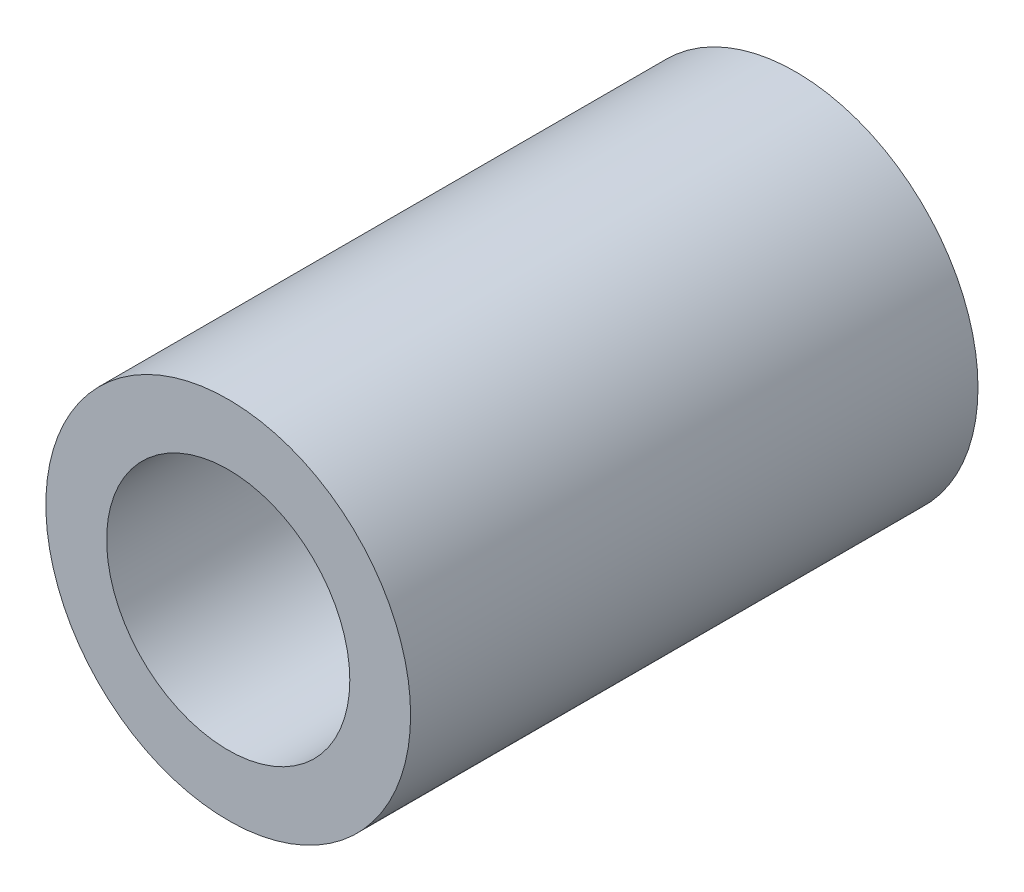
ISO-10303-21;
HEADER;
FILE_DESCRIPTION(('STEP AP214'),'2;1');
FILE_NAME('part.step','',(''),(''),'','','');
FILE_SCHEMA(('AUTOMOTIVE_DESIGN { 1 0 10303 214 1 1 1 1 }'));
ENDSEC;
DATA;
#1=APPLICATION_CONTEXT('core data for automotive mechanical design processes');
#2=APPLICATION_PROTOCOL_DEFINITION('international standard','automotive_design',2000,#1);
#3=PRODUCT_CONTEXT('',#1,'mechanical');
#4=PRODUCT('Part','Part','',(#3));
#5=PRODUCT_RELATED_PRODUCT_CATEGORY('part','',(#4));
#6=PRODUCT_DEFINITION_FORMATION('','',#4);
#7=PRODUCT_DEFINITION_CONTEXT('part definition',#1,'design');
#8=PRODUCT_DEFINITION('design','',#6,#7);
#9=PRODUCT_DEFINITION_SHAPE('','',#8);
#10=(LENGTH_UNIT() NAMED_UNIT(*) SI_UNIT(.MILLI.,.METRE.));
#11=(NAMED_UNIT(*) PLANE_ANGLE_UNIT() SI_UNIT($,.RADIAN.));
#12=(NAMED_UNIT(*) SI_UNIT($,.STERADIAN.) SOLID_ANGLE_UNIT());
#13=UNCERTAINTY_MEASURE_WITH_UNIT(LENGTH_MEASURE(1.E-05),#10,'distance_accuracy_value','');
#14=(GEOMETRIC_REPRESENTATION_CONTEXT(3) GLOBAL_UNCERTAINTY_ASSIGNED_CONTEXT((#13)) GLOBAL_UNIT_ASSIGNED_CONTEXT((#10,
#11,#12)) REPRESENTATION_CONTEXT('',''));
#15=CARTESIAN_POINT('',(0.,0.,0.));
#16=DIRECTION('',(0.,0.,1.));
#17=DIRECTION('',(1.,0.,0.));
#18=AXIS2_PLACEMENT_3D('',#15,#16,#17);
#19=CARTESIAN_POINT('',(0.,0.,7.));
#20=DIRECTION('',(0.,0.,1.));
#21=DIRECTION('',(1.,0.,0.));
#22=AXIS2_PLACEMENT_3D('',#19,#20,#21);
#23=PLANE('',#22);
#24=CARTESIAN_POINT('',(0.,0.,7.));
#25=DIRECTION('',(0.,0.,1.));
#26=DIRECTION('',(1.,0.,0.));
#27=AXIS2_PLACEMENT_3D('',#24,#25,#26);
#28=CIRCLE('',#27,2.25);
#29=CARTESIAN_POINT('',(2.25,0.,7.));
#30=VERTEX_POINT('',#29);
#31=EDGE_CURVE('E10',#30,#30,#28,.T.);
#32=ORIENTED_EDGE('',*,*,#31,.T.);
#33=EDGE_LOOP('',(#32));
#34=FACE_BOUND('',#33,.T.);
#35=CARTESIAN_POINT('',(0.,0.,7.));
#36=DIRECTION('',(0.,0.,1.));
#37=DIRECTION('',(1.,0.,0.));
#38=AXIS2_PLACEMENT_3D('',#35,#36,#37);
#39=CIRCLE('',#38,1.5);
#40=CARTESIAN_POINT('',(1.5,0.,7.));
#41=VERTEX_POINT('',#40);
#42=EDGE_CURVE('E46',#41,#41,#39,.T.);
#43=ORIENTED_EDGE('',*,*,#42,.F.);
#44=EDGE_LOOP('',(#43));
#45=FACE_BOUND('',#44,.T.);
#46=ADVANCED_FACE('F35',(#34,#45),#23,.T.);
#47=CARTESIAN_POINT('',(0.,0.,0.));
#48=DIRECTION('',(0.,0.,1.));
#49=DIRECTION('',(1.,0.,0.));
#50=AXIS2_PLACEMENT_3D('',#47,#48,#49);
#51=PLANE('',#50);
#52=CARTESIAN_POINT('',(0.,0.,0.));
#53=DIRECTION('',(0.,0.,1.));
#54=DIRECTION('',(1.,0.,0.));
#55=AXIS2_PLACEMENT_3D('',#52,#53,#54);
#56=CIRCLE('',#55,2.25);
#57=CARTESIAN_POINT('',(2.25,0.,0.));
#58=VERTEX_POINT('',#57);
#59=EDGE_CURVE('E39',#58,#58,#56,.T.);
#60=ORIENTED_EDGE('',*,*,#59,.F.);
#61=EDGE_LOOP('',(#60));
#62=FACE_BOUND('',#61,.T.);
#63=CARTESIAN_POINT('',(0.,0.,0.));
#64=DIRECTION('',(0.,0.,1.));
#65=DIRECTION('',(1.,0.,0.));
#66=AXIS2_PLACEMENT_3D('',#63,#64,#65);
#67=CIRCLE('',#66,1.5);
#68=CARTESIAN_POINT('',(1.5,0.,0.));
#69=VERTEX_POINT('',#68);
#70=EDGE_CURVE('E48',#69,#69,#67,.T.);
#71=ORIENTED_EDGE('',*,*,#70,.T.);
#72=EDGE_LOOP('',(#71));
#73=FACE_BOUND('',#72,.T.);
#74=ADVANCED_FACE('F58',(#62,#73),#51,.F.);
#75=CARTESIAN_POINT('',(0.,0.,7.));
#76=DIRECTION('',(0.,0.,-1.));
#77=DIRECTION('',(-1.,0.,0.));
#78=AXIS2_PLACEMENT_3D('',#75,#76,#77);
#79=CYLINDRICAL_SURFACE('',#78,2.25);
#80=ORIENTED_EDGE('',*,*,#31,.F.);
#81=EDGE_LOOP('',(#80));
#82=FACE_BOUND('',#81,.T.);
#83=ORIENTED_EDGE('',*,*,#59,.T.);
#84=EDGE_LOOP('',(#83));
#85=FACE_BOUND('',#84,.T.);
#86=ADVANCED_FACE('F37',(#82,#85),#79,.T.);
#87=CARTESIAN_POINT('',(0.,0.,7.));
#88=DIRECTION('',(0.,0.,-1.));
#89=DIRECTION('',(-1.,0.,0.));
#90=AXIS2_PLACEMENT_3D('',#87,#88,#89);
#91=CYLINDRICAL_SURFACE('',#90,1.5);
#92=ORIENTED_EDGE('',*,*,#42,.T.);
#93=EDGE_LOOP('',(#92));
#94=FACE_BOUND('',#93,.T.);
#95=ORIENTED_EDGE('',*,*,#70,.F.);
#96=EDGE_LOOP('',(#95));
#97=FACE_BOUND('',#96,.T.);
#98=ADVANCED_FACE('F54',(#94,#97),#91,.F.);
#99=CLOSED_SHELL('',(#46,#74,#86,#98));
#100=MANIFOLD_SOLID_BREP('B2',#99);
#101=ADVANCED_BREP_SHAPE_REPRESENTATION('',(#18,#100),#14);
#102=SHAPE_DEFINITION_REPRESENTATION(#9,#101);
ENDSEC;
END-ISO-10303-21;
